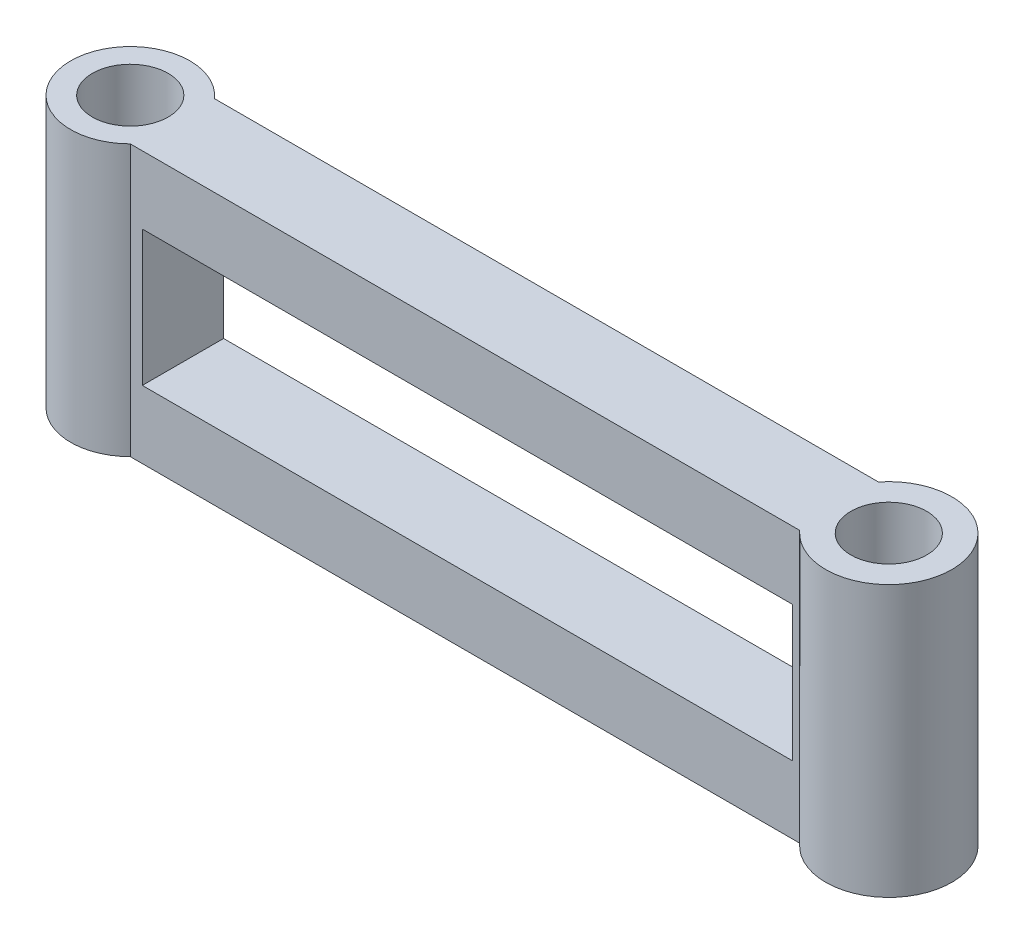
ISO-10303-21;
HEADER;
FILE_DESCRIPTION(('STEP AP214'),'2;1');
FILE_NAME('part.step','',(''),(''),'','','');
FILE_SCHEMA(('AUTOMOTIVE_DESIGN { 1 0 10303 214 1 1 1 1 }'));
ENDSEC;
DATA;
#1=APPLICATION_CONTEXT('core data for automotive mechanical design processes');
#2=APPLICATION_PROTOCOL_DEFINITION('international standard','automotive_design',2000,#1);
#3=PRODUCT_CONTEXT('',#1,'mechanical');
#4=PRODUCT('Part','Part','',(#3));
#5=PRODUCT_RELATED_PRODUCT_CATEGORY('part','',(#4));
#6=PRODUCT_DEFINITION_FORMATION('','',#4);
#7=PRODUCT_DEFINITION_CONTEXT('part definition',#1,'design');
#8=PRODUCT_DEFINITION('design','',#6,#7);
#9=PRODUCT_DEFINITION_SHAPE('','',#8);
#10=(LENGTH_UNIT() NAMED_UNIT(*) SI_UNIT(.MILLI.,.METRE.));
#11=(NAMED_UNIT(*) PLANE_ANGLE_UNIT() SI_UNIT($,.RADIAN.));
#12=(NAMED_UNIT(*) SI_UNIT($,.STERADIAN.) SOLID_ANGLE_UNIT());
#13=UNCERTAINTY_MEASURE_WITH_UNIT(LENGTH_MEASURE(1.E-05),#10,'distance_accuracy_value','');
#14=(GEOMETRIC_REPRESENTATION_CONTEXT(3) GLOBAL_UNCERTAINTY_ASSIGNED_CONTEXT((#13)) GLOBAL_UNIT_ASSIGNED_CONTEXT((#10,
#11,#12)) REPRESENTATION_CONTEXT('',''));
#15=CARTESIAN_POINT('',(0.,0.,0.));
#16=DIRECTION('',(0.,0.,1.));
#17=DIRECTION('',(1.,0.,0.));
#18=AXIS2_PLACEMENT_3D('',#15,#16,#17);
#19=CARTESIAN_POINT('',(-76.2,63.5,7.78387096774195));
#20=DIRECTION('',(0.,1.,0.));
#21=DIRECTION('',(0.,0.,1.));
#22=AXIS2_PLACEMENT_3D('',#19,#20,#21);
#23=PLANE('',#22);
#24=CARTESIAN_POINT('',(-76.2,63.5,7.78387096774195));
#25=DIRECTION('',(0.,1.,0.));
#26=DIRECTION('',(0.,0.,1.));
#27=AXIS2_PLACEMENT_3D('',#24,#25,#26);
#28=CIRCLE('',#27,8.88999999999999);
#29=CARTESIAN_POINT('',(-76.2,63.5,16.6738709677419));
#30=VERTEX_POINT('',#29);
#31=EDGE_CURVE('E133',#30,#30,#28,.T.);
#32=ORIENTED_EDGE('',*,*,#31,.F.);
#33=EDGE_LOOP('',(#32));
#34=FACE_BOUND('',#33,.T.);
#35=CARTESIAN_POINT('',(-76.2,63.5,7.78387096774195));
#36=DIRECTION('',(0.,1.,0.));
#37=DIRECTION('',(0.,0.,1.));
#38=AXIS2_PLACEMENT_3D('',#35,#36,#37);
#39=CIRCLE('',#38,13.97);
#40=CARTESIAN_POINT('',(-65.6624251350699,63.5,-1.3878472990821));
#41=VERTEX_POINT('',#40);
#42=CARTESIAN_POINT('',(-66.3217182668238,63.5,17.6621527009179));
#43=VERTEX_POINT('',#42);
#44=EDGE_CURVE('E139',#41,#43,#39,.T.);
#45=ORIENTED_EDGE('',*,*,#44,.T.);
#46=DIRECTION('',(1.,0.,0.));
#47=VECTOR('',#46,1.);
#48=CARTESIAN_POINT('',(-66.3217182668238,63.5,17.6621527009179));
#49=LINE('',#48,#47);
#50=CARTESIAN_POINT('',(90.5949003310492,63.5,17.6621527009179));
#51=VERTEX_POINT('',#50);
#52=EDGE_CURVE('E142',#43,#51,#49,.T.);
#53=ORIENTED_EDGE('',*,*,#52,.T.);
#54=CARTESIAN_POINT('',(101.6,63.5,7.78387096774193));
#55=DIRECTION('',(0.,1.,0.));
#56=DIRECTION('',(0.,0.,1.));
#57=AXIS2_PLACEMENT_3D('',#54,#55,#56);
#58=CIRCLE('',#57,14.7882611798527);
#59=CARTESIAN_POINT('',(89.9994718759211,63.5,-1.3878472990821));
#60=VERTEX_POINT('',#59);
#61=EDGE_CURVE('E145',#51,#60,#58,.T.);
#62=ORIENTED_EDGE('',*,*,#61,.T.);
#63=DIRECTION('',(-1.,0.,0.));
#64=VECTOR('',#63,1.);
#65=CARTESIAN_POINT('',(-65.6624251350699,63.5,-1.3878472990821));
#66=LINE('',#65,#64);
#67=EDGE_CURVE('E147',#60,#41,#66,.T.);
#68=ORIENTED_EDGE('',*,*,#67,.T.);
#69=EDGE_LOOP('',(#45,#53,#62,#68));
#70=FACE_BOUND('',#69,.T.);
#71=CARTESIAN_POINT('',(101.6,63.5,7.78387096774193));
#72=DIRECTION('',(0.,1.,0.));
#73=DIRECTION('',(0.,0.,1.));
#74=AXIS2_PLACEMENT_3D('',#71,#72,#73);
#75=CIRCLE('',#74,8.88999999999999);
#76=CARTESIAN_POINT('',(101.6,63.5,16.6738709677419));
#77=VERTEX_POINT('',#76);
#78=EDGE_CURVE('E127',#77,#77,#75,.T.);
#79=ORIENTED_EDGE('',*,*,#78,.F.);
#80=EDGE_LOOP('',(#79));
#81=FACE_BOUND('',#80,.T.);
#82=ADVANCED_FACE('F33',(#34,#70,#81),#23,.T.);
#83=CARTESIAN_POINT('',(-76.2,0.,7.78387096774195));
#84=DIRECTION('',(0.,1.,0.));
#85=DIRECTION('',(0.,0.,1.));
#86=AXIS2_PLACEMENT_3D('',#83,#84,#85);
#87=PLANE('',#86);
#88=CARTESIAN_POINT('',(-76.2,0.,7.78387096774195));
#89=DIRECTION('',(0.,1.,0.));
#90=DIRECTION('',(0.,0.,1.));
#91=AXIS2_PLACEMENT_3D('',#88,#89,#90);
#92=CIRCLE('',#91,13.97);
#93=CARTESIAN_POINT('',(-65.6624251350699,0.,-1.3878472990821));
#94=VERTEX_POINT('',#93);
#95=CARTESIAN_POINT('',(-66.3217182668238,0.,17.6621527009179));
#96=VERTEX_POINT('',#95);
#97=EDGE_CURVE('E136',#94,#96,#92,.T.);
#98=ORIENTED_EDGE('',*,*,#97,.F.);
#99=DIRECTION('',(-1.,0.,0.));
#100=VECTOR('',#99,1.);
#101=CARTESIAN_POINT('',(-65.6624251350699,0.,-1.3878472990821));
#102=LINE('',#101,#100);
#103=CARTESIAN_POINT('',(89.9994718759211,0.,-1.3878472990821));
#104=VERTEX_POINT('',#103);
#105=EDGE_CURVE('E143',#104,#94,#102,.T.);
#106=ORIENTED_EDGE('',*,*,#105,.F.);
#107=CARTESIAN_POINT('',(101.6,0.,7.78387096774193));
#108=DIRECTION('',(0.,1.,0.));
#109=DIRECTION('',(0.,0.,1.));
#110=AXIS2_PLACEMENT_3D('',#107,#108,#109);
#111=CIRCLE('',#110,14.7882611798527);
#112=CARTESIAN_POINT('',(90.5949003310492,0.,17.6621527009179));
#113=VERTEX_POINT('',#112);
#114=EDGE_CURVE('E154',#113,#104,#111,.T.);
#115=ORIENTED_EDGE('',*,*,#114,.F.);
#116=DIRECTION('',(1.,0.,0.));
#117=VECTOR('',#116,1.);
#118=CARTESIAN_POINT('',(-66.3217182668238,0.,17.6621527009179));
#119=LINE('',#118,#117);
#120=EDGE_CURVE('E152',#96,#113,#119,.T.);
#121=ORIENTED_EDGE('',*,*,#120,.F.);
#122=EDGE_LOOP('',(#98,#106,#115,#121));
#123=FACE_BOUND('',#122,.T.);
#124=CARTESIAN_POINT('',(-76.2,0.,7.78387096774195));
#125=DIRECTION('',(0.,1.,0.));
#126=DIRECTION('',(0.,0.,1.));
#127=AXIS2_PLACEMENT_3D('',#124,#125,#126);
#128=CIRCLE('',#127,8.88999999999999);
#129=CARTESIAN_POINT('',(-76.2,0.,16.6738709677419));
#130=VERTEX_POINT('',#129);
#131=EDGE_CURVE('E130',#130,#130,#128,.T.);
#132=ORIENTED_EDGE('',*,*,#131,.T.);
#133=EDGE_LOOP('',(#132));
#134=FACE_BOUND('',#133,.T.);
#135=CARTESIAN_POINT('',(101.6,0.,7.78387096774193));
#136=DIRECTION('',(0.,1.,0.));
#137=DIRECTION('',(0.,0.,1.));
#138=AXIS2_PLACEMENT_3D('',#135,#136,#137);
#139=CIRCLE('',#138,8.88999999999999);
#140=CARTESIAN_POINT('',(101.6,0.,16.6738709677419));
#141=VERTEX_POINT('',#140);
#142=EDGE_CURVE('E124',#141,#141,#139,.T.);
#143=ORIENTED_EDGE('',*,*,#142,.T.);
#144=EDGE_LOOP('',(#143));
#145=FACE_BOUND('',#144,.T.);
#146=ADVANCED_FACE('F191',(#123,#134,#145),#87,.F.);
#147=CARTESIAN_POINT('',(-76.2,63.5,7.78387096774195));
#148=DIRECTION('',(0.,-1.,0.));
#149=DIRECTION('',(0.,0.,-1.));
#150=AXIS2_PLACEMENT_3D('',#147,#148,#149);
#151=CYLINDRICAL_SURFACE('',#150,13.97);
#152=ORIENTED_EDGE('',*,*,#97,.T.);
#153=DIRECTION('',(0.,-1.,0.));
#154=VECTOR('',#153,1.);
#155=CARTESIAN_POINT('',(-66.3217182668238,63.5,17.6621527009179));
#156=LINE('',#155,#154);
#157=EDGE_CURVE('E165',#43,#96,#156,.T.);
#158=ORIENTED_EDGE('',*,*,#157,.F.);
#159=ORIENTED_EDGE('',*,*,#44,.F.);
#160=DIRECTION('',(0.,-1.,0.));
#161=VECTOR('',#160,1.);
#162=CARTESIAN_POINT('',(-65.6624251350699,63.5,-1.3878472990821));
#163=LINE('',#162,#161);
#164=EDGE_CURVE('E149',#41,#94,#163,.T.);
#165=ORIENTED_EDGE('',*,*,#164,.T.);
#166=EDGE_LOOP('',(#152,#158,#159,#165));
#167=FACE_BOUND('',#166,.T.);
#168=ADVANCED_FACE('F35',(#167),#151,.T.);
#169=CARTESIAN_POINT('',(-66.3217182668238,63.5,17.6621527009179));
#170=DIRECTION('',(0.,0.,-1.));
#171=DIRECTION('',(-1.,0.,0.));
#172=AXIS2_PLACEMENT_3D('',#169,#170,#171);
#173=PLANE('',#172);
#174=DIRECTION('',(1.,0.,0.));
#175=VECTOR('',#174,1.);
#176=CARTESIAN_POINT('',(-63.5,15.875,17.6621527009179));
#177=LINE('',#176,#175);
#178=CARTESIAN_POINT('',(-63.5,15.875,17.6621527009179));
#179=VERTEX_POINT('',#178);
#180=CARTESIAN_POINT('',(88.9,15.875,17.6621527009179));
#181=VERTEX_POINT('',#180);
#182=EDGE_CURVE('E110',#179,#181,#177,.T.);
#183=ORIENTED_EDGE('',*,*,#182,.F.);
#184=DIRECTION('',(0.,-1.,0.));
#185=VECTOR('',#184,1.);
#186=CARTESIAN_POINT('',(-63.5,47.625,17.6621527009179));
#187=LINE('',#186,#185);
#188=CARTESIAN_POINT('',(-63.5,47.625,17.6621527009179));
#189=VERTEX_POINT('',#188);
#190=EDGE_CURVE('E48',#189,#179,#187,.T.);
#191=ORIENTED_EDGE('',*,*,#190,.F.);
#192=DIRECTION('',(-1.,0.,0.));
#193=VECTOR('',#192,1.);
#194=CARTESIAN_POINT('',(-63.5,47.625,17.6621527009179));
#195=LINE('',#194,#193);
#196=CARTESIAN_POINT('',(88.9,47.625,17.6621527009179));
#197=VERTEX_POINT('',#196);
#198=EDGE_CURVE('E117',#197,#189,#195,.T.);
#199=ORIENTED_EDGE('',*,*,#198,.F.);
#200=DIRECTION('',(0.,1.,0.));
#201=VECTOR('',#200,1.);
#202=CARTESIAN_POINT('',(88.9,47.625,17.6621527009179));
#203=LINE('',#202,#201);
#204=EDGE_CURVE('E101',#181,#197,#203,.T.);
#205=ORIENTED_EDGE('',*,*,#204,.F.);
#206=EDGE_LOOP('',(#183,#191,#199,#205));
#207=FACE_BOUND('',#206,.T.);
#208=ORIENTED_EDGE('',*,*,#120,.T.);
#209=DIRECTION('',(0.,-1.,0.));
#210=VECTOR('',#209,1.);
#211=CARTESIAN_POINT('',(90.5949003310492,63.5,17.6621527009179));
#212=LINE('',#211,#210);
#213=EDGE_CURVE('E162',#51,#113,#212,.T.);
#214=ORIENTED_EDGE('',*,*,#213,.F.);
#215=ORIENTED_EDGE('',*,*,#52,.F.);
#216=ORIENTED_EDGE('',*,*,#157,.T.);
#217=EDGE_LOOP('',(#208,#214,#215,#216));
#218=FACE_BOUND('',#217,.T.);
#219=ADVANCED_FACE('F114',(#207,#218),#173,.F.);
#220=CARTESIAN_POINT('',(101.6,63.5,7.78387096774193));
#221=DIRECTION('',(0.,-1.,0.));
#222=DIRECTION('',(0.,0.,-1.));
#223=AXIS2_PLACEMENT_3D('',#220,#221,#222);
#224=CYLINDRICAL_SURFACE('',#223,14.7882611798527);
#225=ORIENTED_EDGE('',*,*,#114,.T.);
#226=DIRECTION('',(0.,-1.,0.));
#227=VECTOR('',#226,1.);
#228=CARTESIAN_POINT('',(89.9994718759211,63.5,-1.3878472990821));
#229=LINE('',#228,#227);
#230=EDGE_CURVE('E159',#60,#104,#229,.T.);
#231=ORIENTED_EDGE('',*,*,#230,.F.);
#232=ORIENTED_EDGE('',*,*,#61,.F.);
#233=ORIENTED_EDGE('',*,*,#213,.T.);
#234=EDGE_LOOP('',(#225,#231,#232,#233));
#235=FACE_BOUND('',#234,.T.);
#236=ADVANCED_FACE('F205',(#235),#224,.T.);
#237=CARTESIAN_POINT('',(-65.6624251350699,63.5,-1.3878472990821));
#238=DIRECTION('',(0.,0.,1.));
#239=DIRECTION('',(1.,0.,0.));
#240=AXIS2_PLACEMENT_3D('',#237,#238,#239);
#241=PLANE('',#240);
#242=DIRECTION('',(-1.,0.,0.));
#243=VECTOR('',#242,1.);
#244=CARTESIAN_POINT('',(-65.6624251350699,47.625,-1.3878472990821));
#245=LINE('',#244,#243);
#246=CARTESIAN_POINT('',(88.9,47.625,-1.3878472990821));
#247=VERTEX_POINT('',#246);
#248=CARTESIAN_POINT('',(-63.5,47.625,-1.3878472990821));
#249=VERTEX_POINT('',#248);
#250=EDGE_CURVE('E41',#247,#249,#245,.T.);
#251=ORIENTED_EDGE('',*,*,#250,.T.);
#252=DIRECTION('',(0.,-1.,0.));
#253=VECTOR('',#252,1.);
#254=CARTESIAN_POINT('',(-63.5,63.5,-1.3878472990821));
#255=LINE('',#254,#253);
#256=CARTESIAN_POINT('',(-63.5,15.875,-1.3878472990821));
#257=VERTEX_POINT('',#256);
#258=EDGE_CURVE('E11',#249,#257,#255,.T.);
#259=ORIENTED_EDGE('',*,*,#258,.T.);
#260=DIRECTION('',(1.,0.,0.));
#261=VECTOR('',#260,1.);
#262=CARTESIAN_POINT('',(-65.6624251350699,15.875,-1.3878472990821));
#263=LINE('',#262,#261);
#264=CARTESIAN_POINT('',(88.9,15.875,-1.3878472990821));
#265=VERTEX_POINT('',#264);
#266=EDGE_CURVE('E168',#257,#265,#263,.T.);
#267=ORIENTED_EDGE('',*,*,#266,.T.);
#268=DIRECTION('',(0.,1.,0.));
#269=VECTOR('',#268,1.);
#270=CARTESIAN_POINT('',(88.9,63.5,-1.3878472990821));
#271=LINE('',#270,#269);
#272=EDGE_CURVE('E104',#265,#247,#271,.T.);
#273=ORIENTED_EDGE('',*,*,#272,.T.);
#274=EDGE_LOOP('',(#251,#259,#267,#273));
#275=FACE_BOUND('',#274,.T.);
#276=ORIENTED_EDGE('',*,*,#105,.T.);
#277=ORIENTED_EDGE('',*,*,#164,.F.);
#278=ORIENTED_EDGE('',*,*,#67,.F.);
#279=ORIENTED_EDGE('',*,*,#230,.T.);
#280=EDGE_LOOP('',(#276,#277,#278,#279));
#281=FACE_BOUND('',#280,.T.);
#282=ADVANCED_FACE('F172',(#275,#281),#241,.F.);
#283=CARTESIAN_POINT('',(-76.2,63.5,7.78387096774195));
#284=DIRECTION('',(0.,-1.,0.));
#285=DIRECTION('',(0.,0.,-1.));
#286=AXIS2_PLACEMENT_3D('',#283,#284,#285);
#287=CYLINDRICAL_SURFACE('',#286,8.88999999999999);
#288=ORIENTED_EDGE('',*,*,#31,.T.);
#289=EDGE_LOOP('',(#288));
#290=FACE_BOUND('',#289,.T.);
#291=ORIENTED_EDGE('',*,*,#131,.F.);
#292=EDGE_LOOP('',(#291));
#293=FACE_BOUND('',#292,.T.);
#294=ADVANCED_FACE('F186',(#290,#293),#287,.F.);
#295=CARTESIAN_POINT('',(101.6,63.5,7.78387096774193));
#296=DIRECTION('',(0.,-1.,0.));
#297=DIRECTION('',(0.,0.,-1.));
#298=AXIS2_PLACEMENT_3D('',#295,#296,#297);
#299=CYLINDRICAL_SURFACE('',#298,8.88999999999999);
#300=ORIENTED_EDGE('',*,*,#78,.T.);
#301=EDGE_LOOP('',(#300));
#302=FACE_BOUND('',#301,.T.);
#303=ORIENTED_EDGE('',*,*,#142,.F.);
#304=EDGE_LOOP('',(#303));
#305=FACE_BOUND('',#304,.T.);
#306=ADVANCED_FACE('F179',(#302,#305),#299,.F.);
#307=CARTESIAN_POINT('',(-63.5,47.625,-7.00439021211078));
#308=DIRECTION('',(-1.,0.,0.));
#309=DIRECTION('',(0.,0.,1.));
#310=AXIS2_PLACEMENT_3D('',#307,#308,#309);
#311=PLANE('',#310);
#312=DIRECTION('',(0.,0.,1.));
#313=VECTOR('',#312,1.);
#314=CARTESIAN_POINT('',(-63.5,47.625,-7.00439021211078));
#315=LINE('',#314,#313);
#316=EDGE_CURVE('E122',#249,#189,#315,.T.);
#317=ORIENTED_EDGE('',*,*,#316,.T.);
#318=ORIENTED_EDGE('',*,*,#190,.T.);
#319=DIRECTION('',(0.,0.,1.));
#320=VECTOR('',#319,1.);
#321=CARTESIAN_POINT('',(-63.5,15.875,-7.00439021211078));
#322=LINE('',#321,#320);
#323=EDGE_CURVE('E107',#257,#179,#322,.T.);
#324=ORIENTED_EDGE('',*,*,#323,.F.);
#325=ORIENTED_EDGE('',*,*,#258,.F.);
#326=EDGE_LOOP('',(#317,#318,#324,#325));
#327=FACE_BOUND('',#326,.T.);
#328=ADVANCED_FACE('F177',(#327),#311,.F.);
#329=CARTESIAN_POINT('',(-63.5,47.625,-7.00439021211078));
#330=DIRECTION('',(0.,1.,0.));
#331=DIRECTION('',(-1.,0.,0.));
#332=AXIS2_PLACEMENT_3D('',#329,#330,#331);
#333=PLANE('',#332);
#334=DIRECTION('',(0.,0.,1.));
#335=VECTOR('',#334,1.);
#336=CARTESIAN_POINT('',(88.9,47.625,-7.00439021211078));
#337=LINE('',#336,#335);
#338=EDGE_CURVE('E106',#247,#197,#337,.T.);
#339=ORIENTED_EDGE('',*,*,#338,.T.);
#340=ORIENTED_EDGE('',*,*,#198,.T.);
#341=ORIENTED_EDGE('',*,*,#316,.F.);
#342=ORIENTED_EDGE('',*,*,#250,.F.);
#343=EDGE_LOOP('',(#339,#340,#341,#342));
#344=FACE_BOUND('',#343,.T.);
#345=ADVANCED_FACE('F176',(#344),#333,.F.);
#346=CARTESIAN_POINT('',(88.9,47.625,-7.00439021211078));
#347=DIRECTION('',(1.,0.,0.));
#348=DIRECTION('',(0.,0.,-1.));
#349=AXIS2_PLACEMENT_3D('',#346,#347,#348);
#350=PLANE('',#349);
#351=DIRECTION('',(0.,0.,1.));
#352=VECTOR('',#351,1.);
#353=CARTESIAN_POINT('',(88.9,15.875,-7.00439021211078));
#354=LINE('',#353,#352);
#355=EDGE_CURVE('E56',#265,#181,#354,.T.);
#356=ORIENTED_EDGE('',*,*,#355,.T.);
#357=ORIENTED_EDGE('',*,*,#204,.T.);
#358=ORIENTED_EDGE('',*,*,#338,.F.);
#359=ORIENTED_EDGE('',*,*,#272,.F.);
#360=EDGE_LOOP('',(#356,#357,#358,#359));
#361=FACE_BOUND('',#360,.T.);
#362=ADVANCED_FACE('F98',(#361),#350,.F.);
#363=CARTESIAN_POINT('',(-63.5,15.875,-7.00439021211078));
#364=DIRECTION('',(0.,-1.,0.));
#365=DIRECTION('',(0.,0.,-1.));
#366=AXIS2_PLACEMENT_3D('',#363,#364,#365);
#367=PLANE('',#366);
#368=ORIENTED_EDGE('',*,*,#323,.T.);
#369=ORIENTED_EDGE('',*,*,#182,.T.);
#370=ORIENTED_EDGE('',*,*,#355,.F.);
#371=ORIENTED_EDGE('',*,*,#266,.F.);
#372=EDGE_LOOP('',(#368,#369,#370,#371));
#373=FACE_BOUND('',#372,.T.);
#374=ADVANCED_FACE('F111',(#373),#367,.F.);
#375=CLOSED_SHELL('',(#82,#146,#168,#219,#236,#282,#294,#306,#328,#345,#362,#374));
#376=MANIFOLD_SOLID_BREP('B2',#375);
#377=ADVANCED_BREP_SHAPE_REPRESENTATION('',(#18,#376),#14);
#378=SHAPE_DEFINITION_REPRESENTATION(#9,#377);
ENDSEC;
END-ISO-10303-21;
